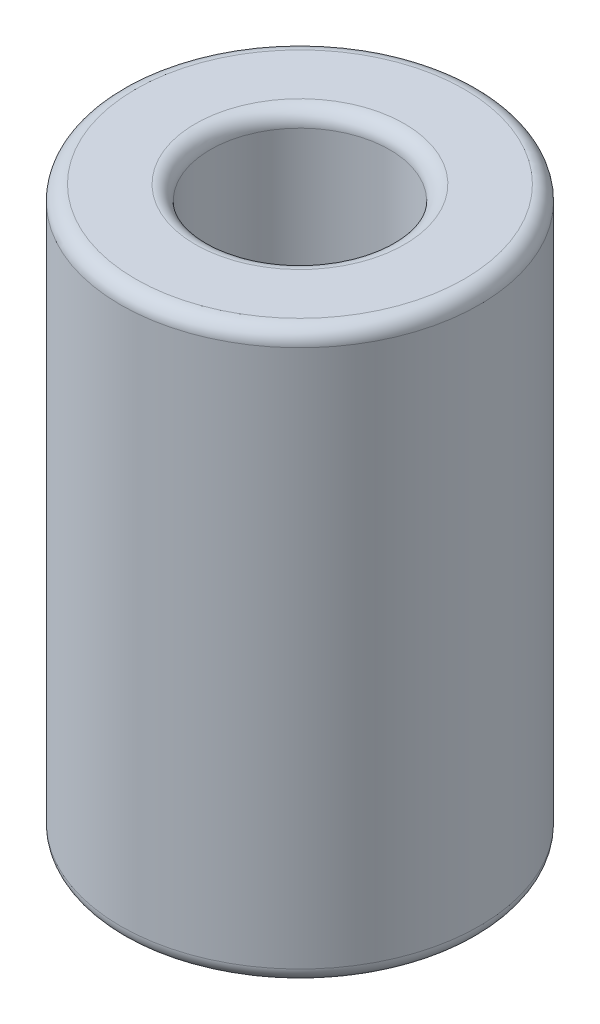
ISO-10303-21;
HEADER;
FILE_DESCRIPTION(('STEP AP214'),'2;1');
FILE_NAME('part.step','',(''),(''),'','','');
FILE_SCHEMA(('AUTOMOTIVE_DESIGN { 1 0 10303 214 1 1 1 1 }'));
ENDSEC;
DATA;
#1=APPLICATION_CONTEXT('core data for automotive mechanical design processes');
#2=APPLICATION_PROTOCOL_DEFINITION('international standard','automotive_design',2000,#1);
#3=PRODUCT_CONTEXT('',#1,'mechanical');
#4=PRODUCT('Part','Part','',(#3));
#5=PRODUCT_RELATED_PRODUCT_CATEGORY('part','',(#4));
#6=PRODUCT_DEFINITION_FORMATION('','',#4);
#7=PRODUCT_DEFINITION_CONTEXT('part definition',#1,'design');
#8=PRODUCT_DEFINITION('design','',#6,#7);
#9=PRODUCT_DEFINITION_SHAPE('','',#8);
#10=(LENGTH_UNIT() NAMED_UNIT(*) SI_UNIT(.MILLI.,.METRE.));
#11=(NAMED_UNIT(*) PLANE_ANGLE_UNIT() SI_UNIT($,.RADIAN.));
#12=(NAMED_UNIT(*) SI_UNIT($,.STERADIAN.) SOLID_ANGLE_UNIT());
#13=UNCERTAINTY_MEASURE_WITH_UNIT(LENGTH_MEASURE(1.E-05),#10,'distance_accuracy_value','');
#14=(GEOMETRIC_REPRESENTATION_CONTEXT(3) GLOBAL_UNCERTAINTY_ASSIGNED_CONTEXT((#13)) GLOBAL_UNIT_ASSIGNED_CONTEXT((#10,
#11,#12)) REPRESENTATION_CONTEXT('',''));
#15=CARTESIAN_POINT('',(0.,0.,0.));
#16=DIRECTION('',(0.,0.,1.));
#17=DIRECTION('',(1.,0.,0.));
#18=AXIS2_PLACEMENT_3D('',#15,#16,#17);
#19=CARTESIAN_POINT('',(0.,19.,0.));
#20=DIRECTION('',(0.,1.,0.));
#21=DIRECTION('',(0.,0.,1.));
#22=AXIS2_PLACEMENT_3D('',#19,#20,#21);
#23=PLANE('',#22);
#24=CARTESIAN_POINT('',(0.,19.,0.));
#25=DIRECTION('',(0.,1.,0.));
#26=DIRECTION('',(0.,0.,1.));
#27=AXIS2_PLACEMENT_3D('',#24,#25,#26);
#28=CIRCLE('',#27,3.5);
#29=CARTESIAN_POINT('',(0.,19.,3.5));
#30=VERTEX_POINT('',#29);
#31=EDGE_CURVE('E10',#30,#30,#28,.F.);
#32=ORIENTED_EDGE('',*,*,#31,.T.);
#33=EDGE_LOOP('',(#32));
#34=FACE_BOUND('',#33,.T.);
#35=CARTESIAN_POINT('',(0.,19.,0.));
#36=DIRECTION('',(0.,1.,0.));
#37=DIRECTION('',(0.,0.,1.));
#38=AXIS2_PLACEMENT_3D('',#35,#36,#37);
#39=CIRCLE('',#38,5.5);
#40=CARTESIAN_POINT('',(0.,19.,5.5));
#41=VERTEX_POINT('',#40);
#42=EDGE_CURVE('E38',#41,#41,#39,.T.);
#43=ORIENTED_EDGE('',*,*,#42,.T.);
#44=EDGE_LOOP('',(#43));
#45=FACE_BOUND('',#44,.T.);
#46=ADVANCED_FACE('F31',(#34,#45),#23,.T.);
#47=CARTESIAN_POINT('',(0.,0.,0.));
#48=DIRECTION('',(0.,1.,0.));
#49=DIRECTION('',(0.,0.,1.));
#50=AXIS2_PLACEMENT_3D('',#47,#48,#49);
#51=PLANE('',#50);
#52=CARTESIAN_POINT('',(0.,0.,0.));
#53=DIRECTION('',(0.,1.,0.));
#54=DIRECTION('',(0.,0.,1.));
#55=AXIS2_PLACEMENT_3D('',#52,#53,#54);
#56=CIRCLE('',#55,3.5);
#57=CARTESIAN_POINT('',(0.,0.,3.5));
#58=VERTEX_POINT('',#57);
#59=EDGE_CURVE('E57',#58,#58,#56,.T.);
#60=ORIENTED_EDGE('',*,*,#59,.T.);
#61=EDGE_LOOP('',(#60));
#62=FACE_BOUND('',#61,.T.);
#63=CARTESIAN_POINT('',(0.,0.,0.));
#64=DIRECTION('',(0.,1.,0.));
#65=DIRECTION('',(0.,0.,1.));
#66=AXIS2_PLACEMENT_3D('',#63,#64,#65);
#67=CIRCLE('',#66,5.5);
#68=CARTESIAN_POINT('',(0.,0.,5.5));
#69=VERTEX_POINT('',#68);
#70=EDGE_CURVE('E60',#69,#69,#67,.F.);
#71=ORIENTED_EDGE('',*,*,#70,.T.);
#72=EDGE_LOOP('',(#71));
#73=FACE_BOUND('',#72,.T.);
#74=ADVANCED_FACE('F64',(#62,#73),#51,.F.);
#75=CARTESIAN_POINT('',(0.,19.,0.));
#76=DIRECTION('',(0.,-1.,0.));
#77=DIRECTION('',(0.,0.,-1.));
#78=AXIS2_PLACEMENT_3D('',#75,#76,#77);
#79=CYLINDRICAL_SURFACE('',#78,6.);
#80=CARTESIAN_POINT('',(0.,0.5,0.));
#81=DIRECTION('',(0.,1.,0.));
#82=DIRECTION('',(0.,0.,1.));
#83=AXIS2_PLACEMENT_3D('',#80,#81,#82);
#84=CIRCLE('',#83,6.);
#85=CARTESIAN_POINT('',(0.,0.5,6.));
#86=VERTEX_POINT('',#85);
#87=EDGE_CURVE('E42',#86,#86,#84,.T.);
#88=ORIENTED_EDGE('',*,*,#87,.T.);
#89=EDGE_LOOP('',(#88));
#90=FACE_BOUND('',#89,.T.);
#91=CARTESIAN_POINT('',(0.,18.5,0.));
#92=DIRECTION('',(0.,1.,0.));
#93=DIRECTION('',(0.,0.,1.));
#94=AXIS2_PLACEMENT_3D('',#91,#92,#93);
#95=CIRCLE('',#94,6.);
#96=CARTESIAN_POINT('',(0.,18.5,6.));
#97=VERTEX_POINT('',#96);
#98=EDGE_CURVE('E46',#97,#97,#95,.F.);
#99=ORIENTED_EDGE('',*,*,#98,.T.);
#100=EDGE_LOOP('',(#99));
#101=FACE_BOUND('',#100,.T.);
#102=ADVANCED_FACE('F74',(#90,#101),#79,.T.);
#103=CARTESIAN_POINT('',(0.,19.,0.));
#104=DIRECTION('',(0.,-1.,0.));
#105=DIRECTION('',(0.,0.,-1.));
#106=AXIS2_PLACEMENT_3D('',#103,#104,#105);
#107=CYLINDRICAL_SURFACE('',#106,3.);
#108=CARTESIAN_POINT('',(0.,0.5,0.));
#109=DIRECTION('',(0.,1.,0.));
#110=DIRECTION('',(0.,0.,1.));
#111=AXIS2_PLACEMENT_3D('',#108,#109,#110);
#112=CIRCLE('',#111,3.);
#113=CARTESIAN_POINT('',(0.,0.5,3.));
#114=VERTEX_POINT('',#113);
#115=EDGE_CURVE('E51',#114,#114,#112,.F.);
#116=ORIENTED_EDGE('',*,*,#115,.T.);
#117=EDGE_LOOP('',(#116));
#118=FACE_BOUND('',#117,.T.);
#119=CARTESIAN_POINT('',(0.,18.5,0.));
#120=DIRECTION('',(0.,1.,0.));
#121=DIRECTION('',(0.,0.,1.));
#122=AXIS2_PLACEMENT_3D('',#119,#120,#121);
#123=CIRCLE('',#122,3.);
#124=CARTESIAN_POINT('',(0.,18.5,3.));
#125=VERTEX_POINT('',#124);
#126=EDGE_CURVE('E54',#125,#125,#123,.T.);
#127=ORIENTED_EDGE('',*,*,#126,.T.);
#128=EDGE_LOOP('',(#127));
#129=FACE_BOUND('',#128,.T.);
#130=ADVANCED_FACE('F77',(#118,#129),#107,.F.);
#131=CARTESIAN_POINT('',(0.,0.5,0.));
#132=DIRECTION('',(0.,1.,0.));
#133=DIRECTION('',(0.,0.,1.));
#134=AXIS2_PLACEMENT_3D('',#131,#132,#133);
#135=TOROIDAL_SURFACE('',#134,3.5,0.5);
#136=ORIENTED_EDGE('',*,*,#115,.F.);
#137=EDGE_LOOP('',(#136));
#138=FACE_BOUND('',#137,.T.);
#139=ORIENTED_EDGE('',*,*,#59,.F.);
#140=EDGE_LOOP('',(#139));
#141=FACE_BOUND('',#140,.T.);
#142=ADVANCED_FACE('F70',(#138,#141),#135,.T.);
#143=CARTESIAN_POINT('',(0.,0.5,0.));
#144=DIRECTION('',(0.,1.,0.));
#145=DIRECTION('',(0.,0.,1.));
#146=AXIS2_PLACEMENT_3D('',#143,#144,#145);
#147=TOROIDAL_SURFACE('',#146,5.5,0.5);
#148=ORIENTED_EDGE('',*,*,#70,.F.);
#149=EDGE_LOOP('',(#148));
#150=FACE_BOUND('',#149,.T.);
#151=ORIENTED_EDGE('',*,*,#87,.F.);
#152=EDGE_LOOP('',(#151));
#153=FACE_BOUND('',#152,.T.);
#154=ADVANCED_FACE('F66',(#150,#153),#147,.T.);
#155=CARTESIAN_POINT('',(0.,18.5,0.));
#156=DIRECTION('',(0.,1.,0.));
#157=DIRECTION('',(0.,0.,1.));
#158=AXIS2_PLACEMENT_3D('',#155,#156,#157);
#159=TOROIDAL_SURFACE('',#158,3.5,0.5);
#160=ORIENTED_EDGE('',*,*,#31,.F.);
#161=EDGE_LOOP('',(#160));
#162=FACE_BOUND('',#161,.T.);
#163=ORIENTED_EDGE('',*,*,#126,.F.);
#164=EDGE_LOOP('',(#163));
#165=FACE_BOUND('',#164,.T.);
#166=ADVANCED_FACE('F69',(#162,#165),#159,.T.);
#167=CARTESIAN_POINT('',(0.,18.5,0.));
#168=DIRECTION('',(0.,1.,0.));
#169=DIRECTION('',(0.,0.,1.));
#170=AXIS2_PLACEMENT_3D('',#167,#168,#169);
#171=TOROIDAL_SURFACE('',#170,5.5,0.5);
#172=ORIENTED_EDGE('',*,*,#98,.F.);
#173=EDGE_LOOP('',(#172));
#174=FACE_BOUND('',#173,.T.);
#175=ORIENTED_EDGE('',*,*,#42,.F.);
#176=EDGE_LOOP('',(#175));
#177=FACE_BOUND('',#176,.T.);
#178=ADVANCED_FACE('F33',(#174,#177),#171,.T.);
#179=CLOSED_SHELL('',(#46,#74,#102,#130,#142,#154,#166,#178));
#180=MANIFOLD_SOLID_BREP('B2',#179);
#181=ADVANCED_BREP_SHAPE_REPRESENTATION('',(#18,#180),#14);
#182=SHAPE_DEFINITION_REPRESENTATION(#9,#181);
ENDSEC;
END-ISO-10303-21;
